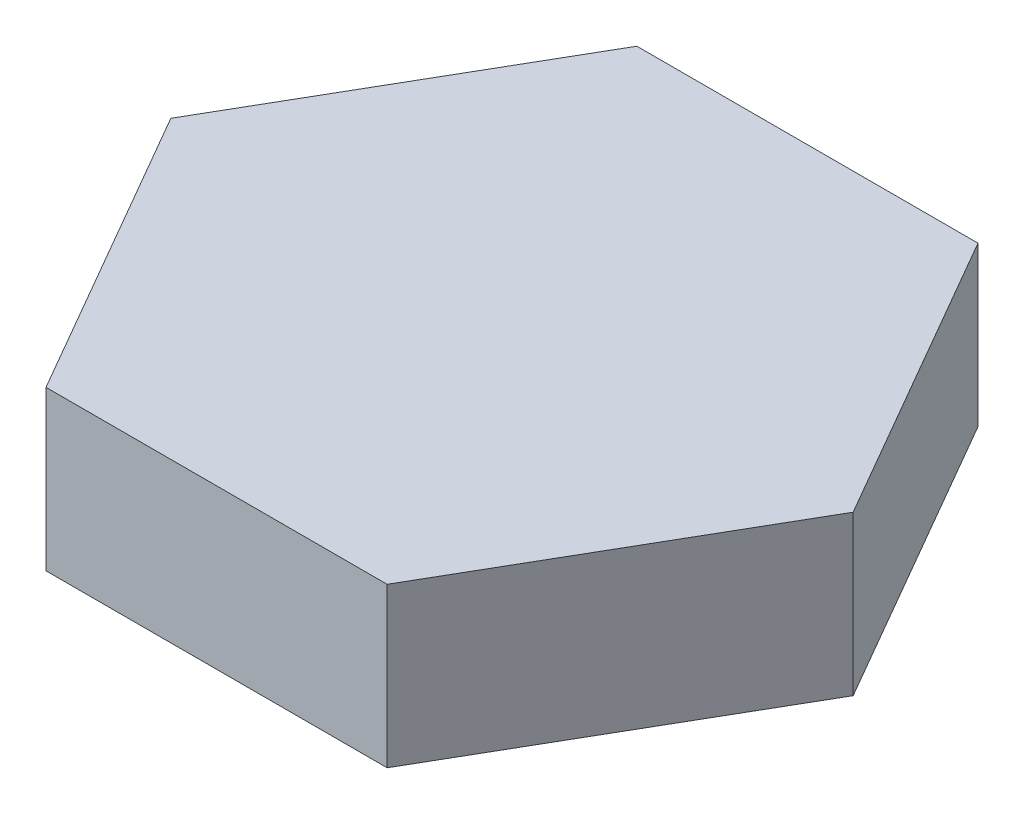
ISO-10303-21;
HEADER;
FILE_DESCRIPTION(('STEP AP214'),'2;1');
FILE_NAME('part.step','',(''),(''),'','','');
FILE_SCHEMA(('AUTOMOTIVE_DESIGN { 1 0 10303 214 1 1 1 1 }'));
ENDSEC;
DATA;
#1=APPLICATION_CONTEXT('core data for automotive mechanical design processes');
#2=APPLICATION_PROTOCOL_DEFINITION('international standard','automotive_design',2000,#1);
#3=PRODUCT_CONTEXT('',#1,'mechanical');
#4=PRODUCT('Part','Part','',(#3));
#5=PRODUCT_RELATED_PRODUCT_CATEGORY('part','',(#4));
#6=PRODUCT_DEFINITION_FORMATION('','',#4);
#7=PRODUCT_DEFINITION_CONTEXT('part definition',#1,'design');
#8=PRODUCT_DEFINITION('design','',#6,#7);
#9=PRODUCT_DEFINITION_SHAPE('','',#8);
#10=(LENGTH_UNIT() NAMED_UNIT(*) SI_UNIT(.MILLI.,.METRE.));
#11=(NAMED_UNIT(*) PLANE_ANGLE_UNIT() SI_UNIT($,.RADIAN.));
#12=(NAMED_UNIT(*) SI_UNIT($,.STERADIAN.) SOLID_ANGLE_UNIT());
#13=UNCERTAINTY_MEASURE_WITH_UNIT(LENGTH_MEASURE(1.E-05),#10,'distance_accuracy_value','');
#14=(GEOMETRIC_REPRESENTATION_CONTEXT(3) GLOBAL_UNCERTAINTY_ASSIGNED_CONTEXT((#13)) GLOBAL_UNIT_ASSIGNED_CONTEXT((#10,
#11,#12)) REPRESENTATION_CONTEXT('',''));
#15=CARTESIAN_POINT('',(0.,0.,0.));
#16=DIRECTION('',(0.,0.,1.));
#17=DIRECTION('',(1.,0.,0.));
#18=AXIS2_PLACEMENT_3D('',#15,#16,#17);
#19=CARTESIAN_POINT('',(0.,0.,0.));
#20=DIRECTION('',(0.,-1.,0.));
#21=DIRECTION('',(0.,0.,-1.));
#22=AXIS2_PLACEMENT_3D('',#19,#20,#21);
#23=PLANE('',#22);
#24=DIRECTION('',(-0.499999999999998,0.,0.866025403784439));
#25=VECTOR('',#24,1.);
#26=CARTESIAN_POINT('',(-95.9999999999999,0.,0.));
#27=LINE('',#26,#25);
#28=CARTESIAN_POINT('',(-48.,0.,-83.1384387633062));
#29=VERTEX_POINT('',#28);
#30=CARTESIAN_POINT('',(-95.9999999999999,0.,0.));
#31=VERTEX_POINT('',#30);
#32=EDGE_CURVE('E97',#29,#31,#27,.T.);
#33=ORIENTED_EDGE('',*,*,#32,.F.);
#34=DIRECTION('',(-1.,0.,0.));
#35=VECTOR('',#34,1.);
#36=CARTESIAN_POINT('',(-48.,0.,-83.1384387633062));
#37=LINE('',#36,#35);
#38=CARTESIAN_POINT('',(48.,0.,-83.1384387633062));
#39=VERTEX_POINT('',#38);
#40=EDGE_CURVE('E115',#39,#29,#37,.T.);
#41=ORIENTED_EDGE('',*,*,#40,.F.);
#42=DIRECTION('',(-0.499999999999998,0.,-0.866025403784439));
#43=VECTOR('',#42,1.);
#44=CARTESIAN_POINT('',(48.,0.,-83.1384387633062));
#45=LINE('',#44,#43);
#46=CARTESIAN_POINT('',(95.9999999999999,0.,0.));
#47=VERTEX_POINT('',#46);
#48=EDGE_CURVE('E112',#47,#39,#45,.T.);
#49=ORIENTED_EDGE('',*,*,#48,.F.);
#50=DIRECTION('',(0.499999999999998,0.,-0.866025403784439));
#51=VECTOR('',#50,1.);
#52=CARTESIAN_POINT('',(95.9999999999999,0.,0.));
#53=LINE('',#52,#51);
#54=CARTESIAN_POINT('',(48.,0.,83.1384387633062));
#55=VERTEX_POINT('',#54);
#56=EDGE_CURVE('E109',#55,#47,#53,.T.);
#57=ORIENTED_EDGE('',*,*,#56,.F.);
#58=DIRECTION('',(1.,0.,0.));
#59=VECTOR('',#58,1.);
#60=CARTESIAN_POINT('',(48.,0.,83.1384387633062));
#61=LINE('',#60,#59);
#62=CARTESIAN_POINT('',(-48.,0.,83.1384387633062));
#63=VERTEX_POINT('',#62);
#64=EDGE_CURVE('E100',#63,#55,#61,.T.);
#65=ORIENTED_EDGE('',*,*,#64,.F.);
#66=DIRECTION('',(0.499999999999998,0.,0.866025403784439));
#67=VECTOR('',#66,1.);
#68=CARTESIAN_POINT('',(-48.,0.,83.1384387633062));
#69=LINE('',#68,#67);
#70=EDGE_CURVE('E89',#31,#63,#69,.T.);
#71=ORIENTED_EDGE('',*,*,#70,.F.);
#72=EDGE_LOOP('',(#33,#41,#49,#57,#65,#71));
#73=FACE_BOUND('',#72,.T.);
#74=ADVANCED_FACE('F33',(#73),#23,.T.);
#75=CARTESIAN_POINT('',(-48.,298.716352399169,-83.1384387633062));
#76=DIRECTION('',(0.,0.,1.));
#77=DIRECTION('',(1.,0.,0.));
#78=AXIS2_PLACEMENT_3D('',#75,#76,#77);
#79=PLANE('',#78);
#80=DIRECTION('',(0.,-1.,0.));
#81=VECTOR('',#80,1.);
#82=CARTESIAN_POINT('',(-48.,298.716352399169,-83.1384387633062));
#83=LINE('',#82,#81);
#84=CARTESIAN_POINT('',(-48.,44.7242265369682,-83.1384387633062));
#85=VERTEX_POINT('',#84);
#86=EDGE_CURVE('E103',#85,#29,#83,.T.);
#87=ORIENTED_EDGE('',*,*,#86,.F.);
#88=DIRECTION('',(1.,0.,0.));
#89=VECTOR('',#88,1.);
#90=CARTESIAN_POINT('',(-48.,44.7242265369682,-83.1384387633062));
#91=LINE('',#90,#89);
#92=CARTESIAN_POINT('',(48.,44.7242265369682,-83.1384387633062));
#93=VERTEX_POINT('',#92);
#94=EDGE_CURVE('E37',#85,#93,#91,.T.);
#95=ORIENTED_EDGE('',*,*,#94,.T.);
#96=DIRECTION('',(0.,-1.,0.));
#97=VECTOR('',#96,1.);
#98=CARTESIAN_POINT('',(48.,298.716352399169,-83.1384387633062));
#99=LINE('',#98,#97);
#100=EDGE_CURVE('E118',#93,#39,#99,.T.);
#101=ORIENTED_EDGE('',*,*,#100,.T.);
#102=ORIENTED_EDGE('',*,*,#40,.T.);
#103=EDGE_LOOP('',(#87,#95,#101,#102));
#104=FACE_BOUND('',#103,.T.);
#105=ADVANCED_FACE('F137',(#104),#79,.F.);
#106=CARTESIAN_POINT('',(48.,298.716352399169,-83.1384387633062));
#107=DIRECTION('',(-0.86602540378444,0.,0.499999999999998));
#108=DIRECTION('',(0.499999999999998,0.,0.86602540378444));
#109=AXIS2_PLACEMENT_3D('',#106,#107,#108);
#110=PLANE('',#109);
#111=ORIENTED_EDGE('',*,*,#100,.F.);
#112=DIRECTION('',(0.499999999999998,0.,0.86602540378444));
#113=VECTOR('',#112,1.);
#114=CARTESIAN_POINT('',(48.,44.7242265369682,-83.1384387633062));
#115=LINE('',#114,#113);
#116=CARTESIAN_POINT('',(95.9999999999999,44.7242265369682,0.));
#117=VERTEX_POINT('',#116);
#118=EDGE_CURVE('E129',#93,#117,#115,.T.);
#119=ORIENTED_EDGE('',*,*,#118,.T.);
#120=DIRECTION('',(0.,-1.,0.));
#121=VECTOR('',#120,1.);
#122=CARTESIAN_POINT('',(95.9999999999999,298.716352399169,0.));
#123=LINE('',#122,#121);
#124=EDGE_CURVE('E120',#117,#47,#123,.T.);
#125=ORIENTED_EDGE('',*,*,#124,.T.);
#126=ORIENTED_EDGE('',*,*,#48,.T.);
#127=EDGE_LOOP('',(#111,#119,#125,#126));
#128=FACE_BOUND('',#127,.T.);
#129=ADVANCED_FACE('F140',(#128),#110,.F.);
#130=CARTESIAN_POINT('',(95.9999999999999,298.716352399169,0.));
#131=DIRECTION('',(-0.86602540378444,0.,-0.499999999999998));
#132=DIRECTION('',(-0.499999999999998,0.,0.86602540378444));
#133=AXIS2_PLACEMENT_3D('',#130,#131,#132);
#134=PLANE('',#133);
#135=ORIENTED_EDGE('',*,*,#124,.F.);
#136=DIRECTION('',(-0.499999999999998,0.,0.86602540378444));
#137=VECTOR('',#136,1.);
#138=CARTESIAN_POINT('',(95.9999999999999,44.7242265369682,0.));
#139=LINE('',#138,#137);
#140=CARTESIAN_POINT('',(48.,44.7242265369682,83.1384387633062));
#141=VERTEX_POINT('',#140);
#142=EDGE_CURVE('E127',#117,#141,#139,.T.);
#143=ORIENTED_EDGE('',*,*,#142,.T.);
#144=DIRECTION('',(0.,-1.,0.));
#145=VECTOR('',#144,1.);
#146=CARTESIAN_POINT('',(48.,298.716352399169,83.1384387633062));
#147=LINE('',#146,#145);
#148=EDGE_CURVE('E122',#141,#55,#147,.T.);
#149=ORIENTED_EDGE('',*,*,#148,.T.);
#150=ORIENTED_EDGE('',*,*,#56,.T.);
#151=EDGE_LOOP('',(#135,#143,#149,#150));
#152=FACE_BOUND('',#151,.T.);
#153=ADVANCED_FACE('F143',(#152),#134,.F.);
#154=CARTESIAN_POINT('',(48.,298.716352399169,83.1384387633062));
#155=DIRECTION('',(0.,0.,-1.));
#156=DIRECTION('',(-1.,0.,0.));
#157=AXIS2_PLACEMENT_3D('',#154,#155,#156);
#158=PLANE('',#157);
#159=ORIENTED_EDGE('',*,*,#148,.F.);
#160=DIRECTION('',(-1.,0.,0.));
#161=VECTOR('',#160,1.);
#162=CARTESIAN_POINT('',(48.,44.7242265369682,83.1384387633062));
#163=LINE('',#162,#161);
#164=CARTESIAN_POINT('',(-48.,44.7242265369682,83.1384387633062));
#165=VERTEX_POINT('',#164);
#166=EDGE_CURVE('E54',#141,#165,#163,.T.);
#167=ORIENTED_EDGE('',*,*,#166,.T.);
#168=DIRECTION('',(0.,-1.,0.));
#169=VECTOR('',#168,1.);
#170=CARTESIAN_POINT('',(-48.,298.716352399169,83.1384387633062));
#171=LINE('',#170,#169);
#172=EDGE_CURVE('E93',#165,#63,#171,.T.);
#173=ORIENTED_EDGE('',*,*,#172,.T.);
#174=ORIENTED_EDGE('',*,*,#64,.T.);
#175=EDGE_LOOP('',(#159,#167,#173,#174));
#176=FACE_BOUND('',#175,.T.);
#177=ADVANCED_FACE('F125',(#176),#158,.F.);
#178=CARTESIAN_POINT('',(-48.,298.716352399169,83.1384387633062));
#179=DIRECTION('',(0.86602540378444,0.,-0.499999999999998));
#180=DIRECTION('',(-0.499999999999998,0.,-0.86602540378444));
#181=AXIS2_PLACEMENT_3D('',#178,#179,#180);
#182=PLANE('',#181);
#183=ORIENTED_EDGE('',*,*,#172,.F.);
#184=DIRECTION('',(-0.499999999999998,0.,-0.86602540378444));
#185=VECTOR('',#184,1.);
#186=CARTESIAN_POINT('',(-48.,44.7242265369682,83.1384387633062));
#187=LINE('',#186,#185);
#188=CARTESIAN_POINT('',(-95.9999999999999,44.7242265369682,0.));
#189=VERTEX_POINT('',#188);
#190=EDGE_CURVE('E42',#165,#189,#187,.T.);
#191=ORIENTED_EDGE('',*,*,#190,.T.);
#192=DIRECTION('',(0.,-1.,0.));
#193=VECTOR('',#192,1.);
#194=CARTESIAN_POINT('',(-95.9999999999999,298.716352399169,0.));
#195=LINE('',#194,#193);
#196=EDGE_CURVE('E86',#189,#31,#195,.T.);
#197=ORIENTED_EDGE('',*,*,#196,.T.);
#198=ORIENTED_EDGE('',*,*,#70,.T.);
#199=EDGE_LOOP('',(#183,#191,#197,#198));
#200=FACE_BOUND('',#199,.T.);
#201=ADVANCED_FACE('F88',(#200),#182,.F.);
#202=CARTESIAN_POINT('',(-95.9999999999999,298.716352399169,0.));
#203=DIRECTION('',(0.86602540378444,0.,0.499999999999998));
#204=DIRECTION('',(0.499999999999998,0.,-0.86602540378444));
#205=AXIS2_PLACEMENT_3D('',#202,#203,#204);
#206=PLANE('',#205);
#207=ORIENTED_EDGE('',*,*,#196,.F.);
#208=DIRECTION('',(0.499999999999998,0.,-0.86602540378444));
#209=VECTOR('',#208,1.);
#210=CARTESIAN_POINT('',(-95.9999999999999,44.7242265369682,0.));
#211=LINE('',#210,#209);
#212=EDGE_CURVE('E11',#189,#85,#211,.T.);
#213=ORIENTED_EDGE('',*,*,#212,.T.);
#214=ORIENTED_EDGE('',*,*,#86,.T.);
#215=ORIENTED_EDGE('',*,*,#32,.T.);
#216=EDGE_LOOP('',(#207,#213,#214,#215));
#217=FACE_BOUND('',#216,.T.);
#218=ADVANCED_FACE('F35',(#217),#206,.F.);
#219=CARTESIAN_POINT('',(24.,44.7242265369682,83.1384387633062));
#220=DIRECTION('',(0.,-1.,0.));
#221=DIRECTION('',(0.,0.,-1.));
#222=AXIS2_PLACEMENT_3D('',#219,#220,#221);
#223=PLANE('',#222);
#224=ORIENTED_EDGE('',*,*,#190,.F.);
#225=ORIENTED_EDGE('',*,*,#166,.F.);
#226=ORIENTED_EDGE('',*,*,#142,.F.);
#227=ORIENTED_EDGE('',*,*,#118,.F.);
#228=ORIENTED_EDGE('',*,*,#94,.F.);
#229=ORIENTED_EDGE('',*,*,#212,.F.);
#230=EDGE_LOOP('',(#224,#225,#226,#227,#228,#229));
#231=FACE_BOUND('',#230,.T.);
#232=ADVANCED_FACE('F138',(#231),#223,.F.);
#233=CLOSED_SHELL('',(#74,#105,#129,#153,#177,#201,#218,#232));
#234=MANIFOLD_SOLID_BREP('B2',#233);
#235=ADVANCED_BREP_SHAPE_REPRESENTATION('',(#18,#234),#14);
#236=SHAPE_DEFINITION_REPRESENTATION(#9,#235);
ENDSEC;
END-ISO-10303-21;
